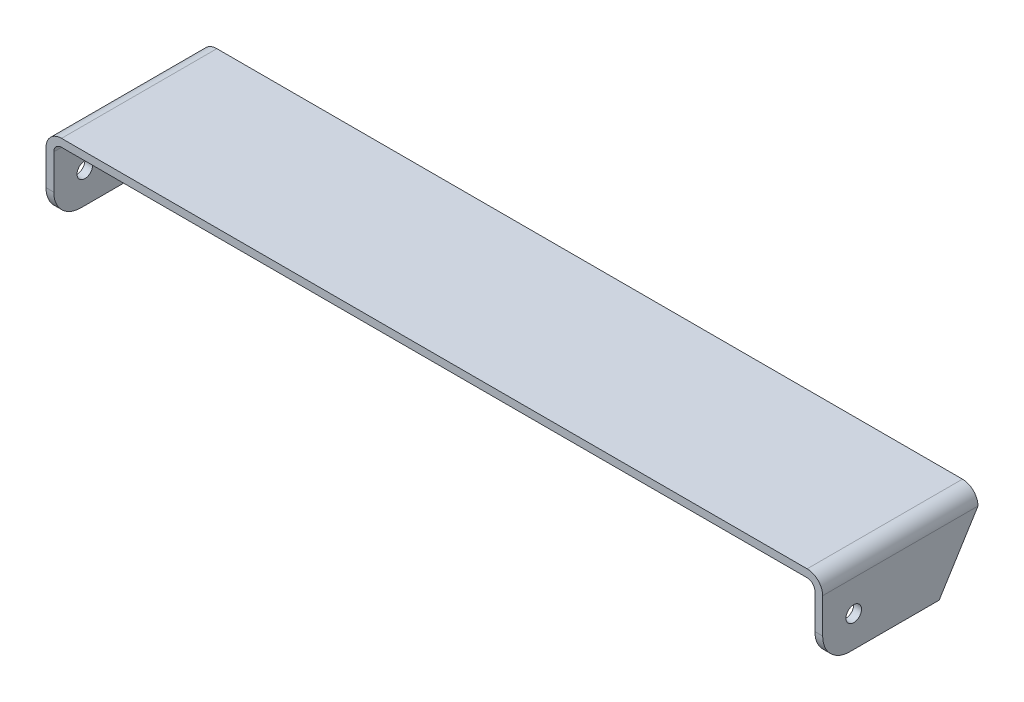
ISO-10303-21;
HEADER;
FILE_DESCRIPTION(('STEP AP214'),'2;1');
FILE_NAME('part.step','',(''),(''),'','','');
FILE_SCHEMA(('AUTOMOTIVE_DESIGN { 1 0 10303 214 1 1 1 1 }'));
ENDSEC;
DATA;
#1=APPLICATION_CONTEXT('core data for automotive mechanical design processes');
#2=APPLICATION_PROTOCOL_DEFINITION('international standard','automotive_design',2000,#1);
#3=PRODUCT_CONTEXT('',#1,'mechanical');
#4=PRODUCT('Part','Part','',(#3));
#5=PRODUCT_RELATED_PRODUCT_CATEGORY('part','',(#4));
#6=PRODUCT_DEFINITION_FORMATION('','',#4);
#7=PRODUCT_DEFINITION_CONTEXT('part definition',#1,'design');
#8=PRODUCT_DEFINITION('design','',#6,#7);
#9=PRODUCT_DEFINITION_SHAPE('','',#8);
#10=(LENGTH_UNIT() NAMED_UNIT(*) SI_UNIT(.MILLI.,.METRE.));
#11=(NAMED_UNIT(*) PLANE_ANGLE_UNIT() SI_UNIT($,.RADIAN.));
#12=(NAMED_UNIT(*) SI_UNIT($,.STERADIAN.) SOLID_ANGLE_UNIT());
#13=UNCERTAINTY_MEASURE_WITH_UNIT(LENGTH_MEASURE(1.E-05),#10,'distance_accuracy_value','');
#14=(GEOMETRIC_REPRESENTATION_CONTEXT(3) GLOBAL_UNCERTAINTY_ASSIGNED_CONTEXT((#13)) GLOBAL_UNIT_ASSIGNED_CONTEXT((#10,
#11,#12)) REPRESENTATION_CONTEXT('',''));
#15=CARTESIAN_POINT('',(0.,0.,0.));
#16=DIRECTION('',(0.,0.,1.));
#17=DIRECTION('',(1.,0.,0.));
#18=AXIS2_PLACEMENT_3D('',#15,#16,#17);
#19=CARTESIAN_POINT('',(490.,79.9999999999999,100.));
#20=DIRECTION('',(1.,0.,0.));
#21=DIRECTION('',(0.,0.,-1.));
#22=AXIS2_PLACEMENT_3D('',#19,#20,#21);
#23=PLANE('',#22);
#24=CARTESIAN_POINT('',(490.,40.,60.));
#25=DIRECTION('',(1.,0.,0.));
#26=DIRECTION('',(0.,0.,-1.));
#27=AXIS2_PLACEMENT_3D('',#24,#25,#26);
#28=CIRCLE('',#27,9.99999999999998);
#29=CARTESIAN_POINT('',(490.,40.,50.));
#30=VERTEX_POINT('',#29);
#31=EDGE_CURVE('E159',#30,#30,#28,.T.);
#32=ORIENTED_EDGE('',*,*,#31,.T.);
#33=EDGE_LOOP('',(#32));
#34=FACE_BOUND('',#33,.T.);
#35=DIRECTION('',(0.,0.,-1.));
#36=VECTOR('',#35,1.);
#37=CARTESIAN_POINT('',(490.,0.,100.));
#38=LINE('',#37,#36);
#39=CARTESIAN_POINT('',(490.,0.,65.));
#40=VERTEX_POINT('',#39);
#41=CARTESIAN_POINT('',(490.,0.,-50.));
#42=VERTEX_POINT('',#41);
#43=EDGE_CURVE('E237',#40,#42,#38,.T.);
#44=ORIENTED_EDGE('',*,*,#43,.F.);
#45=CARTESIAN_POINT('',(490.,35.,65.));
#46=DIRECTION('',(1.,0.,0.));
#47=DIRECTION('',(0.,0.,-1.));
#48=AXIS2_PLACEMENT_3D('',#45,#46,#47);
#49=CIRCLE('',#48,35.);
#50=CARTESIAN_POINT('',(490.,35.,100.));
#51=VERTEX_POINT('',#50);
#52=EDGE_CURVE('E249',#40,#51,#49,.F.);
#53=ORIENTED_EDGE('',*,*,#52,.T.);
#54=DIRECTION('',(0.,1.,0.));
#55=VECTOR('',#54,1.);
#56=CARTESIAN_POINT('',(490.,79.9999999999999,100.));
#57=LINE('',#56,#55);
#58=CARTESIAN_POINT('',(490.,79.9999999999999,100.));
#59=VERTEX_POINT('',#58);
#60=EDGE_CURVE('E174',#59,#51,#57,.F.);
#61=ORIENTED_EDGE('',*,*,#60,.F.);
#62=DIRECTION('',(0.,0.,-1.));
#63=VECTOR('',#62,1.);
#64=CARTESIAN_POINT('',(490.,79.9999999999999,100.));
#65=LINE('',#64,#63);
#66=CARTESIAN_POINT('',(490.,79.9999999999999,-100.));
#67=VERTEX_POINT('',#66);
#68=EDGE_CURVE('E200',#59,#67,#65,.T.);
#69=ORIENTED_EDGE('',*,*,#68,.T.);
#70=DIRECTION('',(0.,-0.847998304005088,0.52999894000318));
#71=VECTOR('',#70,1.);
#72=CARTESIAN_POINT('',(490.,-9.88764044943831,-43.820224719101));
#73=LINE('',#72,#71);
#74=EDGE_CURVE('E170',#67,#42,#73,.T.);
#75=ORIENTED_EDGE('',*,*,#74,.T.);
#76=EDGE_LOOP('',(#44,#53,#61,#69,#75));
#77=FACE_BOUND('',#76,.T.);
#78=ADVANCED_FACE('F36',(#34,#77),#23,.F.);
#79=CARTESIAN_POINT('',(500.,0.,100.));
#80=DIRECTION('',(0.,-1.,0.));
#81=DIRECTION('',(0.,0.,-1.));
#82=AXIS2_PLACEMENT_3D('',#79,#80,#81);
#83=PLANE('',#82);
#84=DIRECTION('',(0.,0.,-1.));
#85=VECTOR('',#84,1.);
#86=CARTESIAN_POINT('',(500.,0.,100.));
#87=LINE('',#86,#85);
#88=CARTESIAN_POINT('',(500.,0.,65.));
#89=VERTEX_POINT('',#88);
#90=CARTESIAN_POINT('',(500.,0.,-50.));
#91=VERTEX_POINT('',#90);
#92=EDGE_CURVE('E235',#89,#91,#87,.T.);
#93=ORIENTED_EDGE('',*,*,#92,.F.);
#94=DIRECTION('',(-1.,0.,0.));
#95=VECTOR('',#94,1.);
#96=CARTESIAN_POINT('',(490.,0.,65.));
#97=LINE('',#96,#95);
#98=EDGE_CURVE('E246',#89,#40,#97,.T.);
#99=ORIENTED_EDGE('',*,*,#98,.T.);
#100=ORIENTED_EDGE('',*,*,#43,.T.);
#101=DIRECTION('',(-1.,0.,0.));
#102=VECTOR('',#101,1.);
#103=CARTESIAN_POINT('',(718.,0.,-50.));
#104=LINE('',#103,#102);
#105=EDGE_CURVE('E153',#91,#42,#104,.T.);
#106=ORIENTED_EDGE('',*,*,#105,.F.);
#107=EDGE_LOOP('',(#93,#99,#100,#106));
#108=FACE_BOUND('',#107,.T.);
#109=ADVANCED_FACE('F270',(#108),#83,.T.);
#110=CARTESIAN_POINT('',(500.,79.9999999999999,100.));
#111=DIRECTION('',(1.,0.,0.));
#112=DIRECTION('',(0.,0.,-1.));
#113=AXIS2_PLACEMENT_3D('',#110,#111,#112);
#114=PLANE('',#113);
#115=CARTESIAN_POINT('',(500.,40.,60.));
#116=DIRECTION('',(1.,0.,0.));
#117=DIRECTION('',(0.,0.,-1.));
#118=AXIS2_PLACEMENT_3D('',#115,#116,#117);
#119=CIRCLE('',#118,9.99999999999998);
#120=CARTESIAN_POINT('',(500.,40.,50.));
#121=VERTEX_POINT('',#120);
#122=EDGE_CURVE('E162',#121,#121,#119,.T.);
#123=ORIENTED_EDGE('',*,*,#122,.F.);
#124=EDGE_LOOP('',(#123));
#125=FACE_BOUND('',#124,.T.);
#126=DIRECTION('',(0.,-1.,0.));
#127=VECTOR('',#126,1.);
#128=CARTESIAN_POINT('',(500.,79.9999999999999,100.));
#129=LINE('',#128,#127);
#130=CARTESIAN_POINT('',(500.,79.9999999999999,100.));
#131=VERTEX_POINT('',#130);
#132=CARTESIAN_POINT('',(500.,35.,100.));
#133=VERTEX_POINT('',#132);
#134=EDGE_CURVE('E177',#131,#133,#129,.T.);
#135=ORIENTED_EDGE('',*,*,#134,.T.);
#136=CARTESIAN_POINT('',(500.,35.,65.));
#137=DIRECTION('',(1.,0.,0.));
#138=DIRECTION('',(0.,0.,-1.));
#139=AXIS2_PLACEMENT_3D('',#136,#137,#138);
#140=CIRCLE('',#139,35.);
#141=EDGE_CURVE('E255',#133,#89,#140,.T.);
#142=ORIENTED_EDGE('',*,*,#141,.T.);
#143=ORIENTED_EDGE('',*,*,#92,.T.);
#144=DIRECTION('',(0.,-0.847998304005088,0.52999894000318));
#145=VECTOR('',#144,1.);
#146=CARTESIAN_POINT('',(500.,-9.88764044943831,-43.820224719101));
#147=LINE('',#146,#145);
#148=CARTESIAN_POINT('',(500.,80.,-100.));
#149=VERTEX_POINT('',#148);
#150=EDGE_CURVE('E167',#149,#91,#147,.T.);
#151=ORIENTED_EDGE('',*,*,#150,.F.);
#152=DIRECTION('',(0.,0.,-1.));
#153=VECTOR('',#152,1.);
#154=CARTESIAN_POINT('',(500.,79.9999999999999,100.));
#155=LINE('',#154,#153);
#156=EDGE_CURVE('E232',#131,#149,#155,.T.);
#157=ORIENTED_EDGE('',*,*,#156,.F.);
#158=EDGE_LOOP('',(#135,#142,#143,#151,#157));
#159=FACE_BOUND('',#158,.T.);
#160=ADVANCED_FACE('F276',(#125,#159),#114,.T.);
#161=CARTESIAN_POINT('',(480.,80.,100.));
#162=DIRECTION('',(0.,0.,-1.));
#163=DIRECTION('',(-1.,0.,0.));
#164=AXIS2_PLACEMENT_3D('',#161,#162,#163);
#165=CYLINDRICAL_SURFACE('',#164,20.);
#166=CARTESIAN_POINT('',(480.,80.,-100.));
#167=DIRECTION('',(0.,0.,-1.));
#168=DIRECTION('',(1.,0.,0.));
#169=AXIS2_PLACEMENT_3D('',#166,#167,#168);
#170=CIRCLE('',#169,20.);
#171=CARTESIAN_POINT('',(480.,100.,-100.));
#172=VERTEX_POINT('',#171);
#173=EDGE_CURVE('E173',#172,#149,#170,.T.);
#174=ORIENTED_EDGE('',*,*,#173,.F.);
#175=DIRECTION('',(0.,0.,-1.));
#176=VECTOR('',#175,1.);
#177=CARTESIAN_POINT('',(480.,100.,100.));
#178=LINE('',#177,#176);
#179=CARTESIAN_POINT('',(480.,100.,100.));
#180=VERTEX_POINT('',#179);
#181=EDGE_CURVE('E230',#180,#172,#178,.T.);
#182=ORIENTED_EDGE('',*,*,#181,.F.);
#183=CARTESIAN_POINT('',(480.,80.,100.));
#184=DIRECTION('',(0.,0.,-1.));
#185=DIRECTION('',(1.,0.,0.));
#186=AXIS2_PLACEMENT_3D('',#183,#184,#185);
#187=CIRCLE('',#186,20.);
#188=EDGE_CURVE('E181',#180,#131,#187,.T.);
#189=ORIENTED_EDGE('',*,*,#188,.T.);
#190=ORIENTED_EDGE('',*,*,#156,.T.);
#191=EDGE_LOOP('',(#174,#182,#189,#190));
#192=FACE_BOUND('',#191,.T.);
#193=ADVANCED_FACE('F283',(#192),#165,.T.);
#194=CARTESIAN_POINT('',(-480.,100.,100.));
#195=DIRECTION('',(0.,1.,0.));
#196=DIRECTION('',(0.,0.,1.));
#197=AXIS2_PLACEMENT_3D('',#194,#195,#196);
#198=PLANE('',#197);
#199=DIRECTION('',(1.,0.,0.));
#200=VECTOR('',#199,1.);
#201=CARTESIAN_POINT('',(-480.,100.,-100.));
#202=LINE('',#201,#200);
#203=CARTESIAN_POINT('',(-480.,100.,-100.));
#204=VERTEX_POINT('',#203);
#205=EDGE_CURVE('E203',#204,#172,#202,.T.);
#206=ORIENTED_EDGE('',*,*,#205,.F.);
#207=DIRECTION('',(0.,0.,-1.));
#208=VECTOR('',#207,1.);
#209=CARTESIAN_POINT('',(-480.,100.,100.));
#210=LINE('',#209,#208);
#211=CARTESIAN_POINT('',(-480.,100.,100.));
#212=VERTEX_POINT('',#211);
#213=EDGE_CURVE('E228',#212,#204,#210,.T.);
#214=ORIENTED_EDGE('',*,*,#213,.F.);
#215=DIRECTION('',(1.,0.,0.));
#216=VECTOR('',#215,1.);
#217=CARTESIAN_POINT('',(-480.,100.,100.));
#218=LINE('',#217,#216);
#219=EDGE_CURVE('E184',#212,#180,#218,.T.);
#220=ORIENTED_EDGE('',*,*,#219,.T.);
#221=ORIENTED_EDGE('',*,*,#181,.T.);
#222=EDGE_LOOP('',(#206,#214,#220,#221));
#223=FACE_BOUND('',#222,.T.);
#224=ADVANCED_FACE('F287',(#223),#198,.T.);
#225=CARTESIAN_POINT('',(-480.,80.,100.));
#226=DIRECTION('',(0.,0.,-1.));
#227=DIRECTION('',(-1.,0.,0.));
#228=AXIS2_PLACEMENT_3D('',#225,#226,#227);
#229=CYLINDRICAL_SURFACE('',#228,20.);
#230=CARTESIAN_POINT('',(-480.,80.,-100.));
#231=DIRECTION('',(0.,0.,-1.));
#232=DIRECTION('',(1.,0.,0.));
#233=AXIS2_PLACEMENT_3D('',#230,#231,#232);
#234=CIRCLE('',#233,20.);
#235=CARTESIAN_POINT('',(-500.,79.9999999999999,-100.));
#236=VERTEX_POINT('',#235);
#237=EDGE_CURVE('E206',#236,#204,#234,.T.);
#238=ORIENTED_EDGE('',*,*,#237,.F.);
#239=DIRECTION('',(0.,0.,-1.));
#240=VECTOR('',#239,1.);
#241=CARTESIAN_POINT('',(-500.,79.9999999999999,100.));
#242=LINE('',#241,#240);
#243=CARTESIAN_POINT('',(-500.,79.9999999999999,100.));
#244=VERTEX_POINT('',#243);
#245=EDGE_CURVE('E143',#244,#236,#242,.T.);
#246=ORIENTED_EDGE('',*,*,#245,.F.);
#247=CARTESIAN_POINT('',(-480.,80.,100.));
#248=DIRECTION('',(0.,0.,-1.));
#249=DIRECTION('',(1.,0.,0.));
#250=AXIS2_PLACEMENT_3D('',#247,#248,#249);
#251=CIRCLE('',#250,20.);
#252=EDGE_CURVE('E187',#244,#212,#251,.T.);
#253=ORIENTED_EDGE('',*,*,#252,.T.);
#254=ORIENTED_EDGE('',*,*,#213,.T.);
#255=EDGE_LOOP('',(#238,#246,#253,#254));
#256=FACE_BOUND('',#255,.T.);
#257=ADVANCED_FACE('F291',(#256),#229,.T.);
#258=CARTESIAN_POINT('',(-500.,0.,100.));
#259=DIRECTION('',(-1.,0.,0.));
#260=DIRECTION('',(0.,0.,1.));
#261=AXIS2_PLACEMENT_3D('',#258,#259,#260);
#262=PLANE('',#261);
#263=CARTESIAN_POINT('',(-500.,40.,60.));
#264=DIRECTION('',(-1.,0.,0.));
#265=DIRECTION('',(0.,0.,1.));
#266=AXIS2_PLACEMENT_3D('',#263,#264,#265);
#267=CIRCLE('',#266,9.99999999999998);
#268=CARTESIAN_POINT('',(-500.,40.,70.));
#269=VERTEX_POINT('',#268);
#270=EDGE_CURVE('E245',#269,#269,#267,.T.);
#271=ORIENTED_EDGE('',*,*,#270,.F.);
#272=EDGE_LOOP('',(#271));
#273=FACE_BOUND('',#272,.T.);
#274=DIRECTION('',(0.,0.,-1.));
#275=VECTOR('',#274,1.);
#276=CARTESIAN_POINT('',(-500.,0.,100.));
#277=LINE('',#276,#275);
#278=CARTESIAN_POINT('',(-500.,0.,65.));
#279=VERTEX_POINT('',#278);
#280=CARTESIAN_POINT('',(-500.,0.,-50.));
#281=VERTEX_POINT('',#280);
#282=EDGE_CURVE('E136',#279,#281,#277,.T.);
#283=ORIENTED_EDGE('',*,*,#282,.F.);
#284=CARTESIAN_POINT('',(-500.,35.,65.));
#285=DIRECTION('',(-1.,0.,0.));
#286=DIRECTION('',(0.,0.,1.));
#287=AXIS2_PLACEMENT_3D('',#284,#285,#286);
#288=CIRCLE('',#287,35.);
#289=CARTESIAN_POINT('',(-500.,35.,100.));
#290=VERTEX_POINT('',#289);
#291=EDGE_CURVE('E44',#279,#290,#288,.T.);
#292=ORIENTED_EDGE('',*,*,#291,.T.);
#293=DIRECTION('',(0.,1.,0.));
#294=VECTOR('',#293,1.);
#295=CARTESIAN_POINT('',(-500.,0.,100.));
#296=LINE('',#295,#294);
#297=EDGE_CURVE('E190',#290,#244,#296,.T.);
#298=ORIENTED_EDGE('',*,*,#297,.T.);
#299=ORIENTED_EDGE('',*,*,#245,.T.);
#300=DIRECTION('',(0.,0.847998304005088,-0.52999894000318));
#301=VECTOR('',#300,1.);
#302=CARTESIAN_POINT('',(-500.,0.,-50.));
#303=LINE('',#302,#301);
#304=EDGE_CURVE('E149',#281,#236,#303,.T.);
#305=ORIENTED_EDGE('',*,*,#304,.F.);
#306=EDGE_LOOP('',(#283,#292,#298,#299,#305));
#307=FACE_BOUND('',#306,.T.);
#308=ADVANCED_FACE('F156',(#273,#307),#262,.T.);
#309=CARTESIAN_POINT('',(-490.,0.,100.));
#310=DIRECTION('',(0.,-1.,0.));
#311=DIRECTION('',(0.,0.,-1.));
#312=AXIS2_PLACEMENT_3D('',#309,#310,#311);
#313=PLANE('',#312);
#314=DIRECTION('',(0.,0.,-1.));
#315=VECTOR('',#314,1.);
#316=CARTESIAN_POINT('',(-490.,0.,100.));
#317=LINE('',#316,#315);
#318=CARTESIAN_POINT('',(-490.,0.,65.));
#319=VERTEX_POINT('',#318);
#320=CARTESIAN_POINT('',(-490.,0.,-50.));
#321=VERTEX_POINT('',#320);
#322=EDGE_CURVE('E144',#319,#321,#317,.T.);
#323=ORIENTED_EDGE('',*,*,#322,.F.);
#324=DIRECTION('',(-1.,0.,0.));
#325=VECTOR('',#324,1.);
#326=CARTESIAN_POINT('',(-500.,0.,65.));
#327=LINE('',#326,#325);
#328=EDGE_CURVE('E140',#319,#279,#327,.T.);
#329=ORIENTED_EDGE('',*,*,#328,.T.);
#330=ORIENTED_EDGE('',*,*,#282,.T.);
#331=EDGE_CURVE('E139',#321,#281,#104,.T.);
#332=ORIENTED_EDGE('',*,*,#331,.F.);
#333=EDGE_LOOP('',(#323,#329,#330,#332));
#334=FACE_BOUND('',#333,.T.);
#335=ADVANCED_FACE('F138',(#334),#313,.T.);
#336=CARTESIAN_POINT('',(-490.,0.,100.));
#337=DIRECTION('',(-1.,0.,0.));
#338=DIRECTION('',(0.,0.,1.));
#339=AXIS2_PLACEMENT_3D('',#336,#337,#338);
#340=PLANE('',#339);
#341=CARTESIAN_POINT('',(-490.,40.,60.));
#342=DIRECTION('',(-1.,0.,0.));
#343=DIRECTION('',(0.,0.,1.));
#344=AXIS2_PLACEMENT_3D('',#341,#342,#343);
#345=CIRCLE('',#344,9.99999999999998);
#346=CARTESIAN_POINT('',(-490.,40.,70.));
#347=VERTEX_POINT('',#346);
#348=EDGE_CURVE('E242',#347,#347,#345,.T.);
#349=ORIENTED_EDGE('',*,*,#348,.T.);
#350=EDGE_LOOP('',(#349));
#351=FACE_BOUND('',#350,.T.);
#352=DIRECTION('',(0.,1.,0.));
#353=VECTOR('',#352,1.);
#354=CARTESIAN_POINT('',(-490.,0.,100.));
#355=LINE('',#354,#353);
#356=CARTESIAN_POINT('',(-490.,35.,100.));
#357=VERTEX_POINT('',#356);
#358=CARTESIAN_POINT('',(-490.,79.9999999999999,100.));
#359=VERTEX_POINT('',#358);
#360=EDGE_CURVE('E192',#357,#359,#355,.T.);
#361=ORIENTED_EDGE('',*,*,#360,.F.);
#362=CARTESIAN_POINT('',(-490.,35.,65.));
#363=DIRECTION('',(-1.,0.,0.));
#364=DIRECTION('',(0.,0.,1.));
#365=AXIS2_PLACEMENT_3D('',#362,#363,#364);
#366=CIRCLE('',#365,35.);
#367=EDGE_CURVE('E11',#357,#319,#366,.F.);
#368=ORIENTED_EDGE('',*,*,#367,.T.);
#369=ORIENTED_EDGE('',*,*,#322,.T.);
#370=DIRECTION('',(0.,0.847998304005088,-0.52999894000318));
#371=VECTOR('',#370,1.);
#372=CARTESIAN_POINT('',(-490.,-67.4157303370787,-7.86516853932583));
#373=LINE('',#372,#371);
#374=CARTESIAN_POINT('',(-490.,80.,-100.));
#375=VERTEX_POINT('',#374);
#376=EDGE_CURVE('E152',#321,#375,#373,.T.);
#377=ORIENTED_EDGE('',*,*,#376,.T.);
#378=DIRECTION('',(0.,0.,-1.));
#379=VECTOR('',#378,1.);
#380=CARTESIAN_POINT('',(-490.,79.9999999999999,100.));
#381=LINE('',#380,#379);
#382=EDGE_CURVE('E223',#359,#375,#381,.T.);
#383=ORIENTED_EDGE('',*,*,#382,.F.);
#384=EDGE_LOOP('',(#361,#368,#369,#377,#383));
#385=FACE_BOUND('',#384,.T.);
#386=ADVANCED_FACE('F301',(#351,#385),#340,.F.);
#387=CARTESIAN_POINT('',(-480.,80.,100.));
#388=DIRECTION('',(0.,0.,-1.));
#389=DIRECTION('',(-1.,0.,0.));
#390=AXIS2_PLACEMENT_3D('',#387,#388,#389);
#391=CYLINDRICAL_SURFACE('',#390,10.);
#392=CARTESIAN_POINT('',(-480.,80.,-100.));
#393=DIRECTION('',(0.,0.,1.));
#394=DIRECTION('',(1.,0.,0.));
#395=AXIS2_PLACEMENT_3D('',#392,#393,#394);
#396=CIRCLE('',#395,10.);
#397=CARTESIAN_POINT('',(-480.,90.,-100.));
#398=VERTEX_POINT('',#397);
#399=EDGE_CURVE('E209',#375,#398,#396,.F.);
#400=ORIENTED_EDGE('',*,*,#399,.T.);
#401=DIRECTION('',(0.,0.,-1.));
#402=VECTOR('',#401,1.);
#403=CARTESIAN_POINT('',(-480.,90.,100.));
#404=LINE('',#403,#402);
#405=CARTESIAN_POINT('',(-480.,90.,100.));
#406=VERTEX_POINT('',#405);
#407=EDGE_CURVE('E220',#406,#398,#404,.T.);
#408=ORIENTED_EDGE('',*,*,#407,.F.);
#409=CARTESIAN_POINT('',(-480.,80.,100.));
#410=DIRECTION('',(0.,0.,1.));
#411=DIRECTION('',(1.,0.,0.));
#412=AXIS2_PLACEMENT_3D('',#409,#410,#411);
#413=CIRCLE('',#412,10.);
#414=EDGE_CURVE('E194',#359,#406,#413,.F.);
#415=ORIENTED_EDGE('',*,*,#414,.F.);
#416=ORIENTED_EDGE('',*,*,#382,.T.);
#417=EDGE_LOOP('',(#400,#408,#415,#416));
#418=FACE_BOUND('',#417,.T.);
#419=ADVANCED_FACE('F304',(#418),#391,.F.);
#420=CARTESIAN_POINT('',(-480.,90.,100.));
#421=DIRECTION('',(0.,1.,0.));
#422=DIRECTION('',(0.,0.,1.));
#423=AXIS2_PLACEMENT_3D('',#420,#421,#422);
#424=PLANE('',#423);
#425=DIRECTION('',(1.,0.,0.));
#426=VECTOR('',#425,1.);
#427=CARTESIAN_POINT('',(-480.,90.,-100.));
#428=LINE('',#427,#426);
#429=CARTESIAN_POINT('',(480.,90.,-100.));
#430=VERTEX_POINT('',#429);
#431=EDGE_CURVE('E211',#398,#430,#428,.T.);
#432=ORIENTED_EDGE('',*,*,#431,.T.);
#433=DIRECTION('',(0.,0.,-1.));
#434=VECTOR('',#433,1.);
#435=CARTESIAN_POINT('',(480.,90.,100.));
#436=LINE('',#435,#434);
#437=CARTESIAN_POINT('',(480.,90.,100.));
#438=VERTEX_POINT('',#437);
#439=EDGE_CURVE('E217',#438,#430,#436,.T.);
#440=ORIENTED_EDGE('',*,*,#439,.F.);
#441=DIRECTION('',(1.,0.,0.));
#442=VECTOR('',#441,1.);
#443=CARTESIAN_POINT('',(-480.,90.,100.));
#444=LINE('',#443,#442);
#445=EDGE_CURVE('E196',#406,#438,#444,.T.);
#446=ORIENTED_EDGE('',*,*,#445,.F.);
#447=ORIENTED_EDGE('',*,*,#407,.T.);
#448=EDGE_LOOP('',(#432,#440,#446,#447));
#449=FACE_BOUND('',#448,.T.);
#450=ADVANCED_FACE('F308',(#449),#424,.F.);
#451=CARTESIAN_POINT('',(480.,80.,100.));
#452=DIRECTION('',(0.,0.,-1.));
#453=DIRECTION('',(-1.,0.,0.));
#454=AXIS2_PLACEMENT_3D('',#451,#452,#453);
#455=CYLINDRICAL_SURFACE('',#454,10.);
#456=CARTESIAN_POINT('',(480.,80.,-100.));
#457=DIRECTION('',(0.,0.,1.));
#458=DIRECTION('',(1.,0.,0.));
#459=AXIS2_PLACEMENT_3D('',#456,#457,#458);
#460=CIRCLE('',#459,10.);
#461=EDGE_CURVE('E178',#430,#67,#460,.F.);
#462=ORIENTED_EDGE('',*,*,#461,.T.);
#463=ORIENTED_EDGE('',*,*,#68,.F.);
#464=CARTESIAN_POINT('',(480.,80.,100.));
#465=DIRECTION('',(0.,0.,1.));
#466=DIRECTION('',(1.,0.,0.));
#467=AXIS2_PLACEMENT_3D('',#464,#465,#466);
#468=CIRCLE('',#467,10.);
#469=EDGE_CURVE('E198',#438,#59,#468,.F.);
#470=ORIENTED_EDGE('',*,*,#469,.F.);
#471=ORIENTED_EDGE('',*,*,#439,.T.);
#472=EDGE_LOOP('',(#462,#463,#470,#471));
#473=FACE_BOUND('',#472,.T.);
#474=ADVANCED_FACE('F312',(#473),#455,.F.);
#475=CARTESIAN_POINT('',(480.,80.,100.));
#476=DIRECTION('',(0.,0.,-1.));
#477=DIRECTION('',(-1.,0.,0.));
#478=AXIS2_PLACEMENT_3D('',#475,#476,#477);
#479=PLANE('',#478);
#480=ORIENTED_EDGE('',*,*,#60,.T.);
#481=DIRECTION('',(-1.,0.,0.));
#482=VECTOR('',#481,1.);
#483=CARTESIAN_POINT('',(500.,35.,100.));
#484=LINE('',#483,#482);
#485=EDGE_CURVE('E253',#51,#133,#484,.F.);
#486=ORIENTED_EDGE('',*,*,#485,.T.);
#487=ORIENTED_EDGE('',*,*,#134,.F.);
#488=ORIENTED_EDGE('',*,*,#188,.F.);
#489=ORIENTED_EDGE('',*,*,#219,.F.);
#490=ORIENTED_EDGE('',*,*,#252,.F.);
#491=ORIENTED_EDGE('',*,*,#297,.F.);
#492=DIRECTION('',(-1.,0.,0.));
#493=VECTOR('',#492,1.);
#494=CARTESIAN_POINT('',(-490.,35.,100.));
#495=LINE('',#494,#493);
#496=EDGE_CURVE('E251',#290,#357,#495,.F.);
#497=ORIENTED_EDGE('',*,*,#496,.T.);
#498=ORIENTED_EDGE('',*,*,#360,.T.);
#499=ORIENTED_EDGE('',*,*,#414,.T.);
#500=ORIENTED_EDGE('',*,*,#445,.T.);
#501=ORIENTED_EDGE('',*,*,#469,.T.);
#502=EDGE_LOOP('',(#480,#486,#487,#488,#489,#490,#491,#497,#498,#499,#500,#501));
#503=FACE_BOUND('',#502,.T.);
#504=ADVANCED_FACE('F260',(#503),#479,.F.);
#505=CARTESIAN_POINT('',(480.,80.,-100.));
#506=DIRECTION('',(0.,0.,-1.));
#507=DIRECTION('',(-1.,0.,0.));
#508=AXIS2_PLACEMENT_3D('',#505,#506,#507);
#509=PLANE('',#508);
#510=DIRECTION('',(1.,0.,0.));
#511=VECTOR('',#510,1.);
#512=CARTESIAN_POINT('',(480.,80.,-100.));
#513=LINE('',#512,#511);
#514=EDGE_CURVE('E241',#236,#375,#513,.T.);
#515=ORIENTED_EDGE('',*,*,#514,.F.);
#516=ORIENTED_EDGE('',*,*,#237,.T.);
#517=ORIENTED_EDGE('',*,*,#205,.T.);
#518=ORIENTED_EDGE('',*,*,#173,.T.);
#519=EDGE_CURVE('E239',#67,#149,#513,.T.);
#520=ORIENTED_EDGE('',*,*,#519,.F.);
#521=ORIENTED_EDGE('',*,*,#461,.F.);
#522=ORIENTED_EDGE('',*,*,#431,.F.);
#523=ORIENTED_EDGE('',*,*,#399,.F.);
#524=EDGE_LOOP('',(#515,#516,#517,#518,#520,#521,#522,#523));
#525=FACE_BOUND('',#524,.T.);
#526=ADVANCED_FACE('F317',(#525),#509,.T.);
#527=CARTESIAN_POINT('',(718.,0.,-50.));
#528=DIRECTION('',(0.,0.52999894000318,0.847998304005088));
#529=DIRECTION('',(0.,-0.847998304005088,0.52999894000318));
#530=AXIS2_PLACEMENT_3D('',#527,#528,#529);
#531=PLANE('',#530);
#532=ORIENTED_EDGE('',*,*,#519,.T.);
#533=ORIENTED_EDGE('',*,*,#150,.T.);
#534=ORIENTED_EDGE('',*,*,#105,.T.);
#535=ORIENTED_EDGE('',*,*,#74,.F.);
#536=EDGE_LOOP('',(#532,#533,#534,#535));
#537=FACE_BOUND('',#536,.T.);
#538=ADVANCED_FACE('F320',(#537),#531,.F.);
#539=ORIENTED_EDGE('',*,*,#331,.T.);
#540=ORIENTED_EDGE('',*,*,#304,.T.);
#541=ORIENTED_EDGE('',*,*,#514,.T.);
#542=ORIENTED_EDGE('',*,*,#376,.F.);
#543=EDGE_LOOP('',(#539,#540,#541,#542));
#544=FACE_BOUND('',#543,.T.);
#545=ADVANCED_FACE('F148',(#544),#531,.F.);
#546=CARTESIAN_POINT('',(785.,40.,60.));
#547=DIRECTION('',(-1.,0.,0.));
#548=DIRECTION('',(0.,0.,1.));
#549=AXIS2_PLACEMENT_3D('',#546,#547,#548);
#550=CYLINDRICAL_SURFACE('',#549,9.99999999999998);
#551=ORIENTED_EDGE('',*,*,#270,.T.);
#552=EDGE_LOOP('',(#551));
#553=FACE_BOUND('',#552,.T.);
#554=ORIENTED_EDGE('',*,*,#348,.F.);
#555=EDGE_LOOP('',(#554));
#556=FACE_BOUND('',#555,.T.);
#557=ADVANCED_FACE('F328',(#553,#556),#550,.F.);
#558=ORIENTED_EDGE('',*,*,#122,.T.);
#559=EDGE_LOOP('',(#558));
#560=FACE_BOUND('',#559,.T.);
#561=ORIENTED_EDGE('',*,*,#31,.F.);
#562=EDGE_LOOP('',(#561));
#563=FACE_BOUND('',#562,.T.);
#564=ADVANCED_FACE('F267',(#560,#563),#550,.F.);
#565=CARTESIAN_POINT('',(500.,35.,65.));
#566=DIRECTION('',(1.,0.,0.));
#567=DIRECTION('',(0.,0.,-1.));
#568=AXIS2_PLACEMENT_3D('',#565,#566,#567);
#569=CYLINDRICAL_SURFACE('',#568,35.);
#570=ORIENTED_EDGE('',*,*,#141,.F.);
#571=ORIENTED_EDGE('',*,*,#485,.F.);
#572=ORIENTED_EDGE('',*,*,#52,.F.);
#573=ORIENTED_EDGE('',*,*,#98,.F.);
#574=EDGE_LOOP('',(#570,#571,#572,#573));
#575=FACE_BOUND('',#574,.T.);
#576=ADVANCED_FACE('F263',(#575),#569,.T.);
#577=CARTESIAN_POINT('',(-490.,35.,65.));
#578=DIRECTION('',(1.,0.,0.));
#579=DIRECTION('',(0.,0.,-1.));
#580=AXIS2_PLACEMENT_3D('',#577,#578,#579);
#581=CYLINDRICAL_SURFACE('',#580,35.);
#582=ORIENTED_EDGE('',*,*,#367,.F.);
#583=ORIENTED_EDGE('',*,*,#496,.F.);
#584=ORIENTED_EDGE('',*,*,#291,.F.);
#585=ORIENTED_EDGE('',*,*,#328,.F.);
#586=EDGE_LOOP('',(#582,#583,#584,#585));
#587=FACE_BOUND('',#586,.T.);
#588=ADVANCED_FACE('F38',(#587),#581,.T.);
#589=CLOSED_SHELL('',(#78,#109,#160,#193,#224,#257,#308,#335,#386,#419,#450,#474,#504,#526,#538,
#545,#557,#564,#576,#588));
#590=MANIFOLD_SOLID_BREP('B2',#589);
#591=ADVANCED_BREP_SHAPE_REPRESENTATION('',(#18,#590),#14);
#592=SHAPE_DEFINITION_REPRESENTATION(#9,#591);
ENDSEC;
END-ISO-10303-21;
